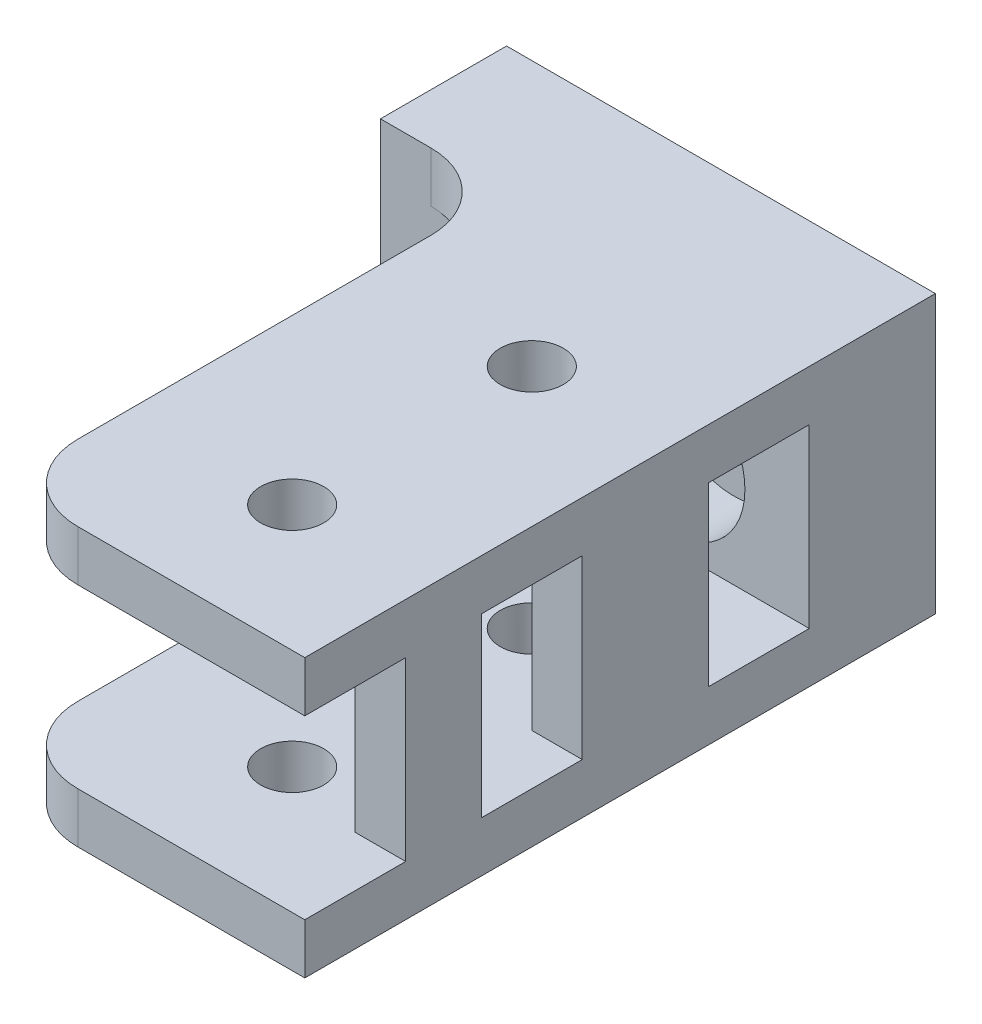
ISO-10303-21;
HEADER;
FILE_DESCRIPTION(('STEP AP214'),'2;1');
FILE_NAME('part.step','',(''),(''),'','','');
FILE_SCHEMA(('AUTOMOTIVE_DESIGN { 1 0 10303 214 1 1 1 1 }'));
ENDSEC;
DATA;
#1=APPLICATION_CONTEXT('core data for automotive mechanical design processes');
#2=APPLICATION_PROTOCOL_DEFINITION('international standard','automotive_design',2000,#1);
#3=PRODUCT_CONTEXT('',#1,'mechanical');
#4=PRODUCT('Part','Part','',(#3));
#5=PRODUCT_RELATED_PRODUCT_CATEGORY('part','',(#4));
#6=PRODUCT_DEFINITION_FORMATION('','',#4);
#7=PRODUCT_DEFINITION_CONTEXT('part definition',#1,'design');
#8=PRODUCT_DEFINITION('design','',#6,#7);
#9=PRODUCT_DEFINITION_SHAPE('','',#8);
#10=(LENGTH_UNIT() NAMED_UNIT(*) SI_UNIT(.MILLI.,.METRE.));
#11=(NAMED_UNIT(*) PLANE_ANGLE_UNIT() SI_UNIT($,.RADIAN.));
#12=(NAMED_UNIT(*) SI_UNIT($,.STERADIAN.) SOLID_ANGLE_UNIT());
#13=UNCERTAINTY_MEASURE_WITH_UNIT(LENGTH_MEASURE(1.E-05),#10,'distance_accuracy_value','');
#14=(GEOMETRIC_REPRESENTATION_CONTEXT(3) GLOBAL_UNCERTAINTY_ASSIGNED_CONTEXT((#13)) GLOBAL_UNIT_ASSIGNED_CONTEXT((#10,
#11,#12)) REPRESENTATION_CONTEXT('',''));
#15=CARTESIAN_POINT('',(0.,0.,0.));
#16=DIRECTION('',(0.,0.,1.));
#17=DIRECTION('',(1.,0.,0.));
#18=AXIS2_PLACEMENT_3D('',#15,#16,#17);
#19=CARTESIAN_POINT('',(11.5,-5.5,5.));
#20=DIRECTION('',(0.,0.,-1.));
#21=DIRECTION('',(-1.,0.,0.));
#22=AXIS2_PLACEMENT_3D('',#19,#20,#21);
#23=CYLINDRICAL_SURFACE('',#22,1.75);
#24=CARTESIAN_POINT('',(11.5,-5.5,0.));
#25=DIRECTION('',(0.,0.,1.));
#26=DIRECTION('',(1.,0.,0.));
#27=AXIS2_PLACEMENT_3D('',#24,#25,#26);
#28=CIRCLE('',#27,1.75);
#29=CARTESIAN_POINT('',(13.25,-5.5,0.));
#30=VERTEX_POINT('',#29);
#31=EDGE_CURVE('E380',#30,#30,#28,.T.);
#32=ORIENTED_EDGE('',*,*,#31,.F.);
#33=EDGE_LOOP('',(#32));
#34=FACE_BOUND('',#33,.T.);
#35=CARTESIAN_POINT('',(11.5,-5.5,2.5));
#36=DIRECTION('',(0.,0.,1.));
#37=DIRECTION('',(1.,0.,0.));
#38=AXIS2_PLACEMENT_3D('',#35,#36,#37);
#39=CIRCLE('',#38,1.75);
#40=CARTESIAN_POINT('',(13.25,-5.5,2.5));
#41=VERTEX_POINT('',#40);
#42=EDGE_CURVE('E232',#41,#41,#39,.T.);
#43=ORIENTED_EDGE('',*,*,#42,.T.);
#44=EDGE_LOOP('',(#43));
#45=FACE_BOUND('',#44,.T.);
#46=ADVANCED_FACE('F35',(#34,#45),#23,.F.);
#47=CARTESIAN_POINT('',(5.5,-5.5,5.));
#48=DIRECTION('',(0.,0.,-1.));
#49=DIRECTION('',(-1.,0.,0.));
#50=AXIS2_PLACEMENT_3D('',#47,#48,#49);
#51=CYLINDRICAL_SURFACE('',#50,1.75);
#52=CARTESIAN_POINT('',(5.5,-5.5,0.));
#53=DIRECTION('',(0.,0.,1.));
#54=DIRECTION('',(1.,0.,0.));
#55=AXIS2_PLACEMENT_3D('',#52,#53,#54);
#56=CIRCLE('',#55,1.75);
#57=CARTESIAN_POINT('',(7.25,-5.5,0.));
#58=VERTEX_POINT('',#57);
#59=EDGE_CURVE('E383',#58,#58,#56,.T.);
#60=ORIENTED_EDGE('',*,*,#59,.F.);
#61=EDGE_LOOP('',(#60));
#62=FACE_BOUND('',#61,.T.);
#63=CARTESIAN_POINT('',(5.5,-5.5,2.5));
#64=DIRECTION('',(0.,0.,1.));
#65=DIRECTION('',(1.,0.,0.));
#66=AXIS2_PLACEMENT_3D('',#63,#64,#65);
#67=CIRCLE('',#66,1.75);
#68=CARTESIAN_POINT('',(7.25,-5.5,2.5));
#69=VERTEX_POINT('',#68);
#70=EDGE_CURVE('E203',#69,#69,#67,.T.);
#71=ORIENTED_EDGE('',*,*,#70,.T.);
#72=EDGE_LOOP('',(#71));
#73=FACE_BOUND('',#72,.T.);
#74=ADVANCED_FACE('F469',(#62,#73),#51,.F.);
#75=CARTESIAN_POINT('',(15.,0.,25.));
#76=DIRECTION('',(-1.,0.,0.));
#77=DIRECTION('',(0.,-1.,0.));
#78=AXIS2_PLACEMENT_3D('',#75,#76,#77);
#79=PLANE('',#78);
#80=DIRECTION('',(0.,-1.,0.));
#81=VECTOR('',#80,1.);
#82=CARTESIAN_POINT('',(15.,-2.,21.));
#83=LINE('',#82,#81);
#84=CARTESIAN_POINT('',(15.,-2.,21.));
#85=VERTEX_POINT('',#84);
#86=CARTESIAN_POINT('',(15.,-9.,21.));
#87=VERTEX_POINT('',#86);
#88=EDGE_CURVE('E296',#85,#87,#83,.T.);
#89=ORIENTED_EDGE('',*,*,#88,.F.);
#90=DIRECTION('',(0.,0.,-1.));
#91=VECTOR('',#90,1.);
#92=CARTESIAN_POINT('',(15.,-2.,25.));
#93=LINE('',#92,#91);
#94=CARTESIAN_POINT('',(15.,-2.,18.));
#95=VERTEX_POINT('',#94);
#96=EDGE_CURVE('E379',#85,#95,#93,.T.);
#97=ORIENTED_EDGE('',*,*,#96,.T.);
#98=DIRECTION('',(0.,1.,0.));
#99=VECTOR('',#98,1.);
#100=CARTESIAN_POINT('',(15.,-2.,18.));
#101=LINE('',#100,#99);
#102=CARTESIAN_POINT('',(15.,-9.,18.));
#103=VERTEX_POINT('',#102);
#104=EDGE_CURVE('E295',#103,#95,#101,.T.);
#105=ORIENTED_EDGE('',*,*,#104,.F.);
#106=DIRECTION('',(0.,0.,-1.));
#107=VECTOR('',#106,1.);
#108=CARTESIAN_POINT('',(15.,-9.,25.));
#109=LINE('',#108,#107);
#110=EDGE_CURVE('E376',#87,#103,#109,.T.);
#111=ORIENTED_EDGE('',*,*,#110,.F.);
#112=EDGE_LOOP('',(#89,#97,#105,#111));
#113=FACE_BOUND('',#112,.T.);
#114=ADVANCED_FACE('F475',(#113),#79,.T.);
#115=CARTESIAN_POINT('',(0.,0.,25.));
#116=DIRECTION('',(0.,0.,1.));
#117=DIRECTION('',(1.,0.,0.));
#118=AXIS2_PLACEMENT_3D('',#115,#116,#117);
#119=PLANE('',#118);
#120=DIRECTION('',(-1.,0.,0.));
#121=VECTOR('',#120,1.);
#122=CARTESIAN_POINT('',(0.,0.,25.));
#123=LINE('',#122,#121);
#124=CARTESIAN_POINT('',(17.,0.,25.));
#125=VERTEX_POINT('',#124);
#126=CARTESIAN_POINT('',(8.,0.,25.));
#127=VERTEX_POINT('',#126);
#128=EDGE_CURVE('E361',#125,#127,#123,.T.);
#129=ORIENTED_EDGE('',*,*,#128,.T.);
#130=DIRECTION('',(0.,-1.,0.));
#131=VECTOR('',#130,1.);
#132=CARTESIAN_POINT('',(8.,-2.,25.));
#133=LINE('',#132,#131);
#134=CARTESIAN_POINT('',(8.,-2.,25.));
#135=VERTEX_POINT('',#134);
#136=EDGE_CURVE('E209',#127,#135,#133,.T.);
#137=ORIENTED_EDGE('',*,*,#136,.T.);
#138=DIRECTION('',(1.,0.,0.));
#139=VECTOR('',#138,1.);
#140=CARTESIAN_POINT('',(0.,-2.,25.));
#141=LINE('',#140,#139);
#142=CARTESIAN_POINT('',(17.,-2.,25.));
#143=VERTEX_POINT('',#142);
#144=EDGE_CURVE('E365',#135,#143,#141,.T.);
#145=ORIENTED_EDGE('',*,*,#144,.T.);
#146=DIRECTION('',(0.,1.,0.));
#147=VECTOR('',#146,1.);
#148=CARTESIAN_POINT('',(17.,0.,25.));
#149=LINE('',#148,#147);
#150=EDGE_CURVE('E362',#143,#125,#149,.T.);
#151=ORIENTED_EDGE('',*,*,#150,.T.);
#152=EDGE_LOOP('',(#129,#137,#145,#151));
#153=FACE_BOUND('',#152,.T.);
#154=ADVANCED_FACE('F448',(#153),#119,.T.);
#155=CARTESIAN_POINT('',(0.,0.,5.));
#156=DIRECTION('',(0.,0.,1.));
#157=DIRECTION('',(1.,0.,0.));
#158=AXIS2_PLACEMENT_3D('',#155,#156,#157);
#159=PLANE('',#158);
#160=CARTESIAN_POINT('',(11.5,-5.5,5.));
#161=DIRECTION('',(0.,0.,1.));
#162=DIRECTION('',(1.,0.,0.));
#163=AXIS2_PLACEMENT_3D('',#160,#161,#162);
#164=CIRCLE('',#163,2.95);
#165=CARTESIAN_POINT('',(14.45,-5.5,5.));
#166=VERTEX_POINT('',#165);
#167=EDGE_CURVE('E431',#166,#166,#164,.T.);
#168=ORIENTED_EDGE('',*,*,#167,.F.);
#169=EDGE_LOOP('',(#168));
#170=FACE_BOUND('',#169,.T.);
#171=CARTESIAN_POINT('',(5.5,-5.5,5.));
#172=DIRECTION('',(0.,0.,1.));
#173=DIRECTION('',(1.,0.,0.));
#174=AXIS2_PLACEMENT_3D('',#171,#172,#173);
#175=CIRCLE('',#174,2.95);
#176=CARTESIAN_POINT('',(8.45,-5.5,5.));
#177=VERTEX_POINT('',#176);
#178=EDGE_CURVE('E234',#177,#177,#175,.T.);
#179=ORIENTED_EDGE('',*,*,#178,.F.);
#180=EDGE_LOOP('',(#179));
#181=FACE_BOUND('',#180,.T.);
#182=DIRECTION('',(1.,0.,0.));
#183=VECTOR('',#182,1.);
#184=CARTESIAN_POINT('',(0.,-11.,5.));
#185=LINE('',#184,#183);
#186=CARTESIAN_POINT('',(0.,-11.,5.));
#187=VERTEX_POINT('',#186);
#188=CARTESIAN_POINT('',(2.,-11.,5.));
#189=VERTEX_POINT('',#188);
#190=EDGE_CURVE('E185',#187,#189,#185,.T.);
#191=ORIENTED_EDGE('',*,*,#190,.T.);
#192=DIRECTION('',(0.,-1.,0.));
#193=VECTOR('',#192,1.);
#194=CARTESIAN_POINT('',(2.,0.,5.));
#195=LINE('',#194,#193);
#196=CARTESIAN_POINT('',(2.,-9.,5.));
#197=VERTEX_POINT('',#196);
#198=EDGE_CURVE('E259',#189,#197,#195,.F.);
#199=ORIENTED_EDGE('',*,*,#198,.T.);
#200=DIRECTION('',(-1.,0.,0.));
#201=VECTOR('',#200,1.);
#202=CARTESIAN_POINT('',(0.,-9.,5.));
#203=LINE('',#202,#201);
#204=CARTESIAN_POINT('',(17.,-9.,5.));
#205=VERTEX_POINT('',#204);
#206=EDGE_CURVE('E50',#205,#197,#203,.T.);
#207=ORIENTED_EDGE('',*,*,#206,.F.);
#208=DIRECTION('',(0.,-1.,0.));
#209=VECTOR('',#208,1.);
#210=CARTESIAN_POINT('',(17.,0.,5.));
#211=LINE('',#210,#209);
#212=CARTESIAN_POINT('',(17.,-2.,5.));
#213=VERTEX_POINT('',#212);
#214=EDGE_CURVE('E355',#213,#205,#211,.T.);
#215=ORIENTED_EDGE('',*,*,#214,.F.);
#216=DIRECTION('',(1.,0.,0.));
#217=VECTOR('',#216,1.);
#218=CARTESIAN_POINT('',(0.,-2.,5.));
#219=LINE('',#218,#217);
#220=CARTESIAN_POINT('',(2.,-2.,5.));
#221=VERTEX_POINT('',#220);
#222=EDGE_CURVE('E58',#221,#213,#219,.T.);
#223=ORIENTED_EDGE('',*,*,#222,.F.);
#224=DIRECTION('',(0.,-1.,0.));
#225=VECTOR('',#224,1.);
#226=CARTESIAN_POINT('',(2.,0.,5.));
#227=LINE('',#226,#225);
#228=CARTESIAN_POINT('',(2.,0.,5.));
#229=VERTEX_POINT('',#228);
#230=EDGE_CURVE('E257',#221,#229,#227,.F.);
#231=ORIENTED_EDGE('',*,*,#230,.T.);
#232=DIRECTION('',(1.,0.,0.));
#233=VECTOR('',#232,1.);
#234=CARTESIAN_POINT('',(0.,0.,5.));
#235=LINE('',#234,#233);
#236=CARTESIAN_POINT('',(0.,0.,5.));
#237=VERTEX_POINT('',#236);
#238=EDGE_CURVE('E188',#237,#229,#235,.T.);
#239=ORIENTED_EDGE('',*,*,#238,.F.);
#240=DIRECTION('',(0.,-1.,0.));
#241=VECTOR('',#240,1.);
#242=CARTESIAN_POINT('',(0.,0.,5.));
#243=LINE('',#242,#241);
#244=EDGE_CURVE('E182',#237,#187,#243,.T.);
#245=ORIENTED_EDGE('',*,*,#244,.T.);
#246=EDGE_LOOP('',(#191,#199,#207,#215,#223,#231,#239,#245));
#247=FACE_BOUND('',#246,.T.);
#248=ADVANCED_FACE('F184',(#170,#181,#247),#159,.T.);
#249=CARTESIAN_POINT('',(0.,0.,0.));
#250=DIRECTION('',(0.,0.,1.));
#251=DIRECTION('',(1.,0.,0.));
#252=AXIS2_PLACEMENT_3D('',#249,#250,#251);
#253=PLANE('',#252);
#254=DIRECTION('',(0.,-1.,0.));
#255=VECTOR('',#254,1.);
#256=CARTESIAN_POINT('',(0.,0.,0.));
#257=LINE('',#256,#255);
#258=CARTESIAN_POINT('',(0.,0.,0.));
#259=VERTEX_POINT('',#258);
#260=CARTESIAN_POINT('',(0.,-11.,0.));
#261=VERTEX_POINT('',#260);
#262=EDGE_CURVE('E208',#259,#261,#257,.T.);
#263=ORIENTED_EDGE('',*,*,#262,.F.);
#264=DIRECTION('',(-1.,0.,0.));
#265=VECTOR('',#264,1.);
#266=CARTESIAN_POINT('',(0.,0.,0.));
#267=LINE('',#266,#265);
#268=CARTESIAN_POINT('',(17.,0.,0.));
#269=VERTEX_POINT('',#268);
#270=EDGE_CURVE('E193',#269,#259,#267,.T.);
#271=ORIENTED_EDGE('',*,*,#270,.F.);
#272=DIRECTION('',(0.,1.,0.));
#273=VECTOR('',#272,1.);
#274=CARTESIAN_POINT('',(17.,0.,0.));
#275=LINE('',#274,#273);
#276=CARTESIAN_POINT('',(17.,-11.,0.));
#277=VERTEX_POINT('',#276);
#278=EDGE_CURVE('E389',#277,#269,#275,.T.);
#279=ORIENTED_EDGE('',*,*,#278,.F.);
#280=DIRECTION('',(1.,0.,0.));
#281=VECTOR('',#280,1.);
#282=CARTESIAN_POINT('',(0.,-11.,0.));
#283=LINE('',#282,#281);
#284=EDGE_CURVE('E387',#261,#277,#283,.T.);
#285=ORIENTED_EDGE('',*,*,#284,.F.);
#286=EDGE_LOOP('',(#263,#271,#279,#285));
#287=FACE_BOUND('',#286,.T.);
#288=ORIENTED_EDGE('',*,*,#59,.T.);
#289=EDGE_LOOP('',(#288));
#290=FACE_BOUND('',#289,.T.);
#291=ORIENTED_EDGE('',*,*,#31,.T.);
#292=EDGE_LOOP('',(#291));
#293=FACE_BOUND('',#292,.T.);
#294=ADVANCED_FACE('F400',(#287,#290,#293),#253,.F.);
#295=CARTESIAN_POINT('',(0.,0.,5.));
#296=DIRECTION('',(1.,0.,0.));
#297=DIRECTION('',(0.,1.,0.));
#298=AXIS2_PLACEMENT_3D('',#295,#296,#297);
#299=PLANE('',#298);
#300=DIRECTION('',(0.,0.,-1.));
#301=VECTOR('',#300,1.);
#302=CARTESIAN_POINT('',(0.,-11.,5.));
#303=LINE('',#302,#301);
#304=EDGE_CURVE('E198',#187,#261,#303,.T.);
#305=ORIENTED_EDGE('',*,*,#304,.F.);
#306=ORIENTED_EDGE('',*,*,#244,.F.);
#307=DIRECTION('',(0.,0.,-1.));
#308=VECTOR('',#307,1.);
#309=CARTESIAN_POINT('',(0.,0.,5.));
#310=LINE('',#309,#308);
#311=EDGE_CURVE('E192',#237,#259,#310,.T.);
#312=ORIENTED_EDGE('',*,*,#311,.T.);
#313=ORIENTED_EDGE('',*,*,#262,.T.);
#314=EDGE_LOOP('',(#305,#306,#312,#313));
#315=FACE_BOUND('',#314,.T.);
#316=ADVANCED_FACE('F206',(#315),#299,.F.);
#317=CARTESIAN_POINT('',(0.,-11.,5.));
#318=DIRECTION('',(0.,1.,0.));
#319=DIRECTION('',(0.,0.,1.));
#320=AXIS2_PLACEMENT_3D('',#317,#318,#319);
#321=PLANE('',#320);
#322=CARTESIAN_POINT('',(11.5,-11.,10.5));
#323=DIRECTION('',(0.,-1.,0.));
#324=DIRECTION('',(0.,0.,-1.));
#325=AXIS2_PLACEMENT_3D('',#322,#323,#324);
#326=CIRCLE('',#325,1.25);
#327=CARTESIAN_POINT('',(11.5,-11.,9.25));
#328=VERTEX_POINT('',#327);
#329=EDGE_CURVE('E421',#328,#328,#326,.T.);
#330=ORIENTED_EDGE('',*,*,#329,.F.);
#331=EDGE_LOOP('',(#330));
#332=FACE_BOUND('',#331,.T.);
#333=CARTESIAN_POINT('',(11.5,-11.,20.));
#334=DIRECTION('',(0.,-1.,0.));
#335=DIRECTION('',(0.,0.,-1.));
#336=AXIS2_PLACEMENT_3D('',#333,#334,#335);
#337=CIRCLE('',#336,1.25);
#338=CARTESIAN_POINT('',(11.5,-11.,18.75));
#339=VERTEX_POINT('',#338);
#340=EDGE_CURVE('E224',#339,#339,#337,.T.);
#341=ORIENTED_EDGE('',*,*,#340,.F.);
#342=EDGE_LOOP('',(#341));
#343=FACE_BOUND('',#342,.T.);
#344=DIRECTION('',(1.,0.,0.));
#345=VECTOR('',#344,1.);
#346=CARTESIAN_POINT('',(0.,-11.,25.));
#347=LINE('',#346,#345);
#348=CARTESIAN_POINT('',(8.,-11.,25.));
#349=VERTEX_POINT('',#348);
#350=CARTESIAN_POINT('',(17.,-11.,25.));
#351=VERTEX_POINT('',#350);
#352=EDGE_CURVE('E370',#349,#351,#347,.T.);
#353=ORIENTED_EDGE('',*,*,#352,.F.);
#354=CARTESIAN_POINT('',(8.,-11.,22.));
#355=DIRECTION('',(0.,1.,0.));
#356=DIRECTION('',(0.,0.,1.));
#357=AXIS2_PLACEMENT_3D('',#354,#355,#356);
#358=CIRCLE('',#357,3.);
#359=CARTESIAN_POINT('',(5.,-11.,22.));
#360=VERTEX_POINT('',#359);
#361=EDGE_CURVE('E255',#349,#360,#358,.F.);
#362=ORIENTED_EDGE('',*,*,#361,.T.);
#363=DIRECTION('',(0.,0.,1.));
#364=VECTOR('',#363,1.);
#365=CARTESIAN_POINT('',(5.,-11.,5.));
#366=LINE('',#365,#364);
#367=CARTESIAN_POINT('',(5.,-11.,8.));
#368=VERTEX_POINT('',#367);
#369=EDGE_CURVE('E202',#368,#360,#366,.T.);
#370=ORIENTED_EDGE('',*,*,#369,.F.);
#371=CARTESIAN_POINT('',(2.,-11.,8.));
#372=DIRECTION('',(0.,1.,0.));
#373=DIRECTION('',(0.,0.,1.));
#374=AXIS2_PLACEMENT_3D('',#371,#372,#373);
#375=CIRCLE('',#374,3.);
#376=EDGE_CURVE('E201',#368,#189,#375,.T.);
#377=ORIENTED_EDGE('',*,*,#376,.T.);
#378=ORIENTED_EDGE('',*,*,#190,.F.);
#379=ORIENTED_EDGE('',*,*,#304,.T.);
#380=ORIENTED_EDGE('',*,*,#284,.T.);
#381=DIRECTION('',(0.,0.,-1.));
#382=VECTOR('',#381,1.);
#383=CARTESIAN_POINT('',(17.,-11.,5.));
#384=LINE('',#383,#382);
#385=EDGE_CURVE('E210',#351,#277,#384,.T.);
#386=ORIENTED_EDGE('',*,*,#385,.F.);
#387=EDGE_LOOP('',(#353,#362,#370,#377,#378,#379,#380,#386));
#388=FACE_BOUND('',#387,.T.);
#389=ADVANCED_FACE('F197',(#332,#343,#388),#321,.F.);
#390=CARTESIAN_POINT('',(17.,0.,5.));
#391=DIRECTION('',(-1.,0.,0.));
#392=DIRECTION('',(0.,0.,1.));
#393=AXIS2_PLACEMENT_3D('',#390,#391,#392);
#394=PLANE('',#393);
#395=DIRECTION('',(0.,0.,1.));
#396=VECTOR('',#395,1.);
#397=CARTESIAN_POINT('',(17.,-9.,5.));
#398=LINE('',#397,#396);
#399=CARTESIAN_POINT('',(17.,-9.,14.));
#400=VERTEX_POINT('',#399);
#401=CARTESIAN_POINT('',(17.,-9.,18.));
#402=VERTEX_POINT('',#401);
#403=EDGE_CURVE('E334',#400,#402,#398,.T.);
#404=ORIENTED_EDGE('',*,*,#403,.T.);
#405=DIRECTION('',(0.,1.,0.));
#406=VECTOR('',#405,1.);
#407=CARTESIAN_POINT('',(17.,0.,18.));
#408=LINE('',#407,#406);
#409=CARTESIAN_POINT('',(17.,-2.,18.));
#410=VERTEX_POINT('',#409);
#411=EDGE_CURVE('E325',#402,#410,#408,.T.);
#412=ORIENTED_EDGE('',*,*,#411,.T.);
#413=DIRECTION('',(0.,0.,-1.));
#414=VECTOR('',#413,1.);
#415=CARTESIAN_POINT('',(17.,-2.,5.));
#416=LINE('',#415,#414);
#417=CARTESIAN_POINT('',(17.,-2.,14.));
#418=VERTEX_POINT('',#417);
#419=EDGE_CURVE('E331',#410,#418,#416,.T.);
#420=ORIENTED_EDGE('',*,*,#419,.T.);
#421=DIRECTION('',(0.,-1.,0.));
#422=VECTOR('',#421,1.);
#423=CARTESIAN_POINT('',(17.,0.,14.));
#424=LINE('',#423,#422);
#425=EDGE_CURVE('E322',#418,#400,#424,.T.);
#426=ORIENTED_EDGE('',*,*,#425,.T.);
#427=EDGE_LOOP('',(#404,#412,#420,#426));
#428=FACE_BOUND('',#427,.T.);
#429=DIRECTION('',(0.,0.,-1.));
#430=VECTOR('',#429,1.);
#431=CARTESIAN_POINT('',(17.,-2.,5.));
#432=LINE('',#431,#430);
#433=CARTESIAN_POINT('',(17.,-2.,9.));
#434=VERTEX_POINT('',#433);
#435=EDGE_CURVE('E352',#434,#213,#432,.T.);
#436=ORIENTED_EDGE('',*,*,#435,.T.);
#437=ORIENTED_EDGE('',*,*,#214,.T.);
#438=DIRECTION('',(0.,0.,1.));
#439=VECTOR('',#438,1.);
#440=CARTESIAN_POINT('',(17.,-9.,5.));
#441=LINE('',#440,#439);
#442=CARTESIAN_POINT('',(17.,-9.,9.));
#443=VERTEX_POINT('',#442);
#444=EDGE_CURVE('E344',#205,#443,#441,.T.);
#445=ORIENTED_EDGE('',*,*,#444,.T.);
#446=DIRECTION('',(0.,1.,0.));
#447=VECTOR('',#446,1.);
#448=CARTESIAN_POINT('',(17.,0.,9.));
#449=LINE('',#448,#447);
#450=EDGE_CURVE('E349',#443,#434,#449,.T.);
#451=ORIENTED_EDGE('',*,*,#450,.T.);
#452=EDGE_LOOP('',(#436,#437,#445,#451));
#453=FACE_BOUND('',#452,.T.);
#454=ORIENTED_EDGE('',*,*,#150,.F.);
#455=DIRECTION('',(0.,0.,-1.));
#456=VECTOR('',#455,1.);
#457=CARTESIAN_POINT('',(17.,-2.,5.));
#458=LINE('',#457,#456);
#459=CARTESIAN_POINT('',(17.,-2.,21.));
#460=VERTEX_POINT('',#459);
#461=EDGE_CURVE('E319',#143,#460,#458,.T.);
#462=ORIENTED_EDGE('',*,*,#461,.T.);
#463=DIRECTION('',(0.,-1.,0.));
#464=VECTOR('',#463,1.);
#465=CARTESIAN_POINT('',(17.,0.,21.));
#466=LINE('',#465,#464);
#467=CARTESIAN_POINT('',(17.,-9.,21.));
#468=VERTEX_POINT('',#467);
#469=EDGE_CURVE('E328',#460,#468,#466,.T.);
#470=ORIENTED_EDGE('',*,*,#469,.T.);
#471=DIRECTION('',(0.,0.,1.));
#472=VECTOR('',#471,1.);
#473=CARTESIAN_POINT('',(17.,-9.,5.));
#474=LINE('',#473,#472);
#475=CARTESIAN_POINT('',(17.,-9.,25.));
#476=VERTEX_POINT('',#475);
#477=EDGE_CURVE('E303',#468,#476,#474,.T.);
#478=ORIENTED_EDGE('',*,*,#477,.T.);
#479=EDGE_CURVE('E358',#351,#476,#149,.T.);
#480=ORIENTED_EDGE('',*,*,#479,.F.);
#481=ORIENTED_EDGE('',*,*,#385,.T.);
#482=ORIENTED_EDGE('',*,*,#278,.T.);
#483=DIRECTION('',(0.,0.,-1.));
#484=VECTOR('',#483,1.);
#485=CARTESIAN_POINT('',(17.,0.,5.));
#486=LINE('',#485,#484);
#487=EDGE_CURVE('E216',#125,#269,#486,.T.);
#488=ORIENTED_EDGE('',*,*,#487,.F.);
#489=EDGE_LOOP('',(#454,#462,#470,#478,#480,#481,#482,#488));
#490=FACE_BOUND('',#489,.T.);
#491=ADVANCED_FACE('F404',(#428,#453,#490),#394,.F.);
#492=CARTESIAN_POINT('',(0.,0.,5.));
#493=DIRECTION('',(0.,-1.,0.));
#494=DIRECTION('',(0.,0.,-1.));
#495=AXIS2_PLACEMENT_3D('',#492,#493,#494);
#496=PLANE('',#495);
#497=CARTESIAN_POINT('',(11.5,0.,10.5));
#498=DIRECTION('',(0.,-1.,0.));
#499=DIRECTION('',(0.,0.,-1.));
#500=AXIS2_PLACEMENT_3D('',#497,#498,#499);
#501=CIRCLE('',#500,1.25);
#502=CARTESIAN_POINT('',(11.5,0.,9.25));
#503=VERTEX_POINT('',#502);
#504=EDGE_CURVE('E285',#503,#503,#501,.T.);
#505=ORIENTED_EDGE('',*,*,#504,.T.);
#506=EDGE_LOOP('',(#505));
#507=FACE_BOUND('',#506,.T.);
#508=CARTESIAN_POINT('',(11.5,0.,20.));
#509=DIRECTION('',(0.,-1.,0.));
#510=DIRECTION('',(0.,0.,-1.));
#511=AXIS2_PLACEMENT_3D('',#508,#509,#510);
#512=CIRCLE('',#511,1.25);
#513=CARTESIAN_POINT('',(11.5,0.,18.75));
#514=VERTEX_POINT('',#513);
#515=EDGE_CURVE('E292',#514,#514,#512,.T.);
#516=ORIENTED_EDGE('',*,*,#515,.T.);
#517=EDGE_LOOP('',(#516));
#518=FACE_BOUND('',#517,.T.);
#519=DIRECTION('',(0.,0.,1.));
#520=VECTOR('',#519,1.);
#521=CARTESIAN_POINT('',(5.,0.,5.));
#522=LINE('',#521,#520);
#523=CARTESIAN_POINT('',(5.,0.,8.));
#524=VERTEX_POINT('',#523);
#525=CARTESIAN_POINT('',(5.,0.,22.));
#526=VERTEX_POINT('',#525);
#527=EDGE_CURVE('E278',#524,#526,#522,.T.);
#528=ORIENTED_EDGE('',*,*,#527,.T.);
#529=CARTESIAN_POINT('',(8.,0.,22.));
#530=DIRECTION('',(0.,-1.,0.));
#531=DIRECTION('',(0.,0.,-1.));
#532=AXIS2_PLACEMENT_3D('',#529,#530,#531);
#533=CIRCLE('',#532,3.);
#534=EDGE_CURVE('E243',#526,#127,#533,.F.);
#535=ORIENTED_EDGE('',*,*,#534,.T.);
#536=ORIENTED_EDGE('',*,*,#128,.F.);
#537=ORIENTED_EDGE('',*,*,#487,.T.);
#538=ORIENTED_EDGE('',*,*,#270,.T.);
#539=ORIENTED_EDGE('',*,*,#311,.F.);
#540=ORIENTED_EDGE('',*,*,#238,.T.);
#541=CARTESIAN_POINT('',(2.,0.,8.));
#542=DIRECTION('',(0.,-1.,0.));
#543=DIRECTION('',(0.,0.,-1.));
#544=AXIS2_PLACEMENT_3D('',#541,#542,#543);
#545=CIRCLE('',#544,3.);
#546=EDGE_CURVE('E11',#229,#524,#545,.T.);
#547=ORIENTED_EDGE('',*,*,#546,.T.);
#548=EDGE_LOOP('',(#528,#535,#536,#537,#538,#539,#540,#547));
#549=FACE_BOUND('',#548,.T.);
#550=ADVANCED_FACE('F275',(#507,#518,#549),#496,.F.);
#551=CARTESIAN_POINT('',(0.,-2.,25.));
#552=DIRECTION('',(0.,1.,0.));
#553=DIRECTION('',(-1.,0.,0.));
#554=AXIS2_PLACEMENT_3D('',#551,#552,#553);
#555=PLANE('',#554);
#556=CARTESIAN_POINT('',(11.5,-2.,10.5));
#557=DIRECTION('',(0.,1.,0.));
#558=DIRECTION('',(-1.,0.,0.));
#559=AXIS2_PLACEMENT_3D('',#556,#557,#558);
#560=CIRCLE('',#559,1.25);
#561=CARTESIAN_POINT('',(10.25,-2.,10.5));
#562=VERTEX_POINT('',#561);
#563=EDGE_CURVE('E228',#562,#562,#560,.T.);
#564=ORIENTED_EDGE('',*,*,#563,.T.);
#565=EDGE_LOOP('',(#564));
#566=FACE_BOUND('',#565,.T.);
#567=CARTESIAN_POINT('',(11.5,-2.,20.));
#568=DIRECTION('',(0.,1.,0.));
#569=DIRECTION('',(-1.,0.,0.));
#570=AXIS2_PLACEMENT_3D('',#567,#568,#569);
#571=CIRCLE('',#570,1.25);
#572=CARTESIAN_POINT('',(10.25,-2.,20.));
#573=VERTEX_POINT('',#572);
#574=EDGE_CURVE('E223',#573,#573,#571,.T.);
#575=ORIENTED_EDGE('',*,*,#574,.T.);
#576=EDGE_LOOP('',(#575));
#577=FACE_BOUND('',#576,.T.);
#578=ORIENTED_EDGE('',*,*,#144,.F.);
#579=CARTESIAN_POINT('',(8.,-2.,22.));
#580=DIRECTION('',(0.,1.,0.));
#581=DIRECTION('',(-1.,0.,0.));
#582=AXIS2_PLACEMENT_3D('',#579,#580,#581);
#583=CIRCLE('',#582,3.);
#584=CARTESIAN_POINT('',(5.,-2.,22.));
#585=VERTEX_POINT('',#584);
#586=EDGE_CURVE('E213',#135,#585,#583,.F.);
#587=ORIENTED_EDGE('',*,*,#586,.T.);
#588=DIRECTION('',(0.,0.,-1.));
#589=VECTOR('',#588,1.);
#590=CARTESIAN_POINT('',(5.,-2.,25.));
#591=LINE('',#590,#589);
#592=CARTESIAN_POINT('',(5.,-2.,8.));
#593=VERTEX_POINT('',#592);
#594=EDGE_CURVE('E269',#585,#593,#591,.T.);
#595=ORIENTED_EDGE('',*,*,#594,.T.);
#596=CARTESIAN_POINT('',(2.,-2.,8.));
#597=DIRECTION('',(0.,1.,0.));
#598=DIRECTION('',(-1.,0.,0.));
#599=AXIS2_PLACEMENT_3D('',#596,#597,#598);
#600=CIRCLE('',#599,3.);
#601=EDGE_CURVE('E43',#593,#221,#600,.T.);
#602=ORIENTED_EDGE('',*,*,#601,.T.);
#603=ORIENTED_EDGE('',*,*,#222,.T.);
#604=ORIENTED_EDGE('',*,*,#435,.F.);
#605=DIRECTION('',(-1.,0.,0.));
#606=VECTOR('',#605,1.);
#607=CARTESIAN_POINT('',(35.,-1.99999999999999,9.));
#608=LINE('',#607,#606);
#609=CARTESIAN_POINT('',(15.,-2.,9.));
#610=VERTEX_POINT('',#609);
#611=EDGE_CURVE('E341',#434,#610,#608,.T.);
#612=ORIENTED_EDGE('',*,*,#611,.T.);
#613=CARTESIAN_POINT('',(15.,-2.,14.));
#614=VERTEX_POINT('',#613);
#615=EDGE_CURVE('E377',#614,#610,#93,.T.);
#616=ORIENTED_EDGE('',*,*,#615,.F.);
#617=DIRECTION('',(-1.,0.,0.));
#618=VECTOR('',#617,1.);
#619=CARTESIAN_POINT('',(35.,-1.99999999999999,14.));
#620=LINE('',#619,#618);
#621=EDGE_CURVE('E314',#418,#614,#620,.T.);
#622=ORIENTED_EDGE('',*,*,#621,.F.);
#623=ORIENTED_EDGE('',*,*,#419,.F.);
#624=DIRECTION('',(-1.,0.,0.));
#625=VECTOR('',#624,1.);
#626=CARTESIAN_POINT('',(35.,-1.99999999999999,18.));
#627=LINE('',#626,#625);
#628=EDGE_CURVE('E309',#410,#95,#627,.T.);
#629=ORIENTED_EDGE('',*,*,#628,.T.);
#630=ORIENTED_EDGE('',*,*,#96,.F.);
#631=DIRECTION('',(-1.,0.,0.));
#632=VECTOR('',#631,1.);
#633=CARTESIAN_POINT('',(35.,-1.99999999999999,21.));
#634=LINE('',#633,#632);
#635=EDGE_CURVE('E301',#460,#85,#634,.T.);
#636=ORIENTED_EDGE('',*,*,#635,.F.);
#637=ORIENTED_EDGE('',*,*,#461,.F.);
#638=EDGE_LOOP('',(#578,#587,#595,#602,#603,#604,#612,#616,#622,#623,#629,#630,#636,#637));
#639=FACE_BOUND('',#638,.T.);
#640=ADVANCED_FACE('F267',(#566,#577,#639),#555,.F.);
#641=DIRECTION('',(0.,-1.,0.));
#642=VECTOR('',#641,1.);
#643=CARTESIAN_POINT('',(15.,-2.,14.));
#644=LINE('',#643,#642);
#645=CARTESIAN_POINT('',(15.,-9.,14.));
#646=VERTEX_POINT('',#645);
#647=EDGE_CURVE('E307',#614,#646,#644,.T.);
#648=ORIENTED_EDGE('',*,*,#647,.F.);
#649=ORIENTED_EDGE('',*,*,#615,.T.);
#650=DIRECTION('',(0.,1.,0.));
#651=VECTOR('',#650,1.);
#652=CARTESIAN_POINT('',(15.,-2.,9.));
#653=LINE('',#652,#651);
#654=CARTESIAN_POINT('',(15.,-9.,9.));
#655=VERTEX_POINT('',#654);
#656=EDGE_CURVE('E337',#655,#610,#653,.T.);
#657=ORIENTED_EDGE('',*,*,#656,.F.);
#658=EDGE_CURVE('E372',#646,#655,#109,.T.);
#659=ORIENTED_EDGE('',*,*,#658,.F.);
#660=EDGE_LOOP('',(#648,#649,#657,#659));
#661=FACE_BOUND('',#660,.T.);
#662=ADVANCED_FACE('F517',(#661),#79,.T.);
#663=CARTESIAN_POINT('',(0.,-9.,25.));
#664=DIRECTION('',(0.,-1.,0.));
#665=DIRECTION('',(1.,0.,0.));
#666=AXIS2_PLACEMENT_3D('',#663,#664,#665);
#667=PLANE('',#666);
#668=CARTESIAN_POINT('',(11.5,-9.,10.5));
#669=DIRECTION('',(0.,-1.,0.));
#670=DIRECTION('',(1.,0.,0.));
#671=AXIS2_PLACEMENT_3D('',#668,#669,#670);
#672=CIRCLE('',#671,1.25);
#673=CARTESIAN_POINT('',(12.75,-9.,10.5));
#674=VERTEX_POINT('',#673);
#675=EDGE_CURVE('E225',#674,#674,#672,.T.);
#676=ORIENTED_EDGE('',*,*,#675,.T.);
#677=EDGE_LOOP('',(#676));
#678=FACE_BOUND('',#677,.T.);
#679=CARTESIAN_POINT('',(11.5,-9.,20.));
#680=DIRECTION('',(0.,-1.,0.));
#681=DIRECTION('',(1.,0.,0.));
#682=AXIS2_PLACEMENT_3D('',#679,#680,#681);
#683=CIRCLE('',#682,1.25);
#684=CARTESIAN_POINT('',(12.75,-9.,20.));
#685=VERTEX_POINT('',#684);
#686=EDGE_CURVE('E220',#685,#685,#683,.T.);
#687=ORIENTED_EDGE('',*,*,#686,.T.);
#688=EDGE_LOOP('',(#687));
#689=FACE_BOUND('',#688,.T.);
#690=DIRECTION('',(0.,0.,1.));
#691=VECTOR('',#690,1.);
#692=CARTESIAN_POINT('',(5.,-9.,25.));
#693=LINE('',#692,#691);
#694=CARTESIAN_POINT('',(5.,-9.,8.));
#695=VERTEX_POINT('',#694);
#696=CARTESIAN_POINT('',(5.,-9.,22.));
#697=VERTEX_POINT('',#696);
#698=EDGE_CURVE('E417',#695,#697,#693,.T.);
#699=ORIENTED_EDGE('',*,*,#698,.T.);
#700=CARTESIAN_POINT('',(8.,-9.,22.));
#701=DIRECTION('',(0.,-1.,0.));
#702=DIRECTION('',(1.,0.,0.));
#703=AXIS2_PLACEMENT_3D('',#700,#701,#702);
#704=CIRCLE('',#703,3.);
#705=CARTESIAN_POINT('',(8.,-9.,25.));
#706=VERTEX_POINT('',#705);
#707=EDGE_CURVE('E251',#697,#706,#704,.F.);
#708=ORIENTED_EDGE('',*,*,#707,.T.);
#709=DIRECTION('',(-1.,0.,0.));
#710=VECTOR('',#709,1.);
#711=CARTESIAN_POINT('',(0.,-9.,25.));
#712=LINE('',#711,#710);
#713=EDGE_CURVE('E367',#476,#706,#712,.T.);
#714=ORIENTED_EDGE('',*,*,#713,.F.);
#715=ORIENTED_EDGE('',*,*,#477,.F.);
#716=DIRECTION('',(-1.,0.,0.));
#717=VECTOR('',#716,1.);
#718=CARTESIAN_POINT('',(35.,-8.99999999999999,21.));
#719=LINE('',#718,#717);
#720=EDGE_CURVE('E299',#468,#87,#719,.T.);
#721=ORIENTED_EDGE('',*,*,#720,.T.);
#722=ORIENTED_EDGE('',*,*,#110,.T.);
#723=DIRECTION('',(-1.,0.,0.));
#724=VECTOR('',#723,1.);
#725=CARTESIAN_POINT('',(35.,-8.99999999999999,18.));
#726=LINE('',#725,#724);
#727=EDGE_CURVE('E300',#402,#103,#726,.T.);
#728=ORIENTED_EDGE('',*,*,#727,.F.);
#729=ORIENTED_EDGE('',*,*,#403,.F.);
#730=DIRECTION('',(-1.,0.,0.));
#731=VECTOR('',#730,1.);
#732=CARTESIAN_POINT('',(35.,-8.99999999999999,14.));
#733=LINE('',#732,#731);
#734=EDGE_CURVE('E311',#400,#646,#733,.T.);
#735=ORIENTED_EDGE('',*,*,#734,.T.);
#736=ORIENTED_EDGE('',*,*,#658,.T.);
#737=DIRECTION('',(-1.,0.,0.));
#738=VECTOR('',#737,1.);
#739=CARTESIAN_POINT('',(35.,-8.99999999999999,9.));
#740=LINE('',#739,#738);
#741=EDGE_CURVE('E340',#443,#655,#740,.T.);
#742=ORIENTED_EDGE('',*,*,#741,.F.);
#743=ORIENTED_EDGE('',*,*,#444,.F.);
#744=ORIENTED_EDGE('',*,*,#206,.T.);
#745=CARTESIAN_POINT('',(2.,-9.,8.));
#746=DIRECTION('',(0.,-1.,0.));
#747=DIRECTION('',(1.,0.,0.));
#748=AXIS2_PLACEMENT_3D('',#745,#746,#747);
#749=CIRCLE('',#748,3.);
#750=EDGE_CURVE('E262',#197,#695,#749,.T.);
#751=ORIENTED_EDGE('',*,*,#750,.T.);
#752=EDGE_LOOP('',(#699,#708,#714,#715,#721,#722,#728,#729,#735,#736,#742,#743,#744,#751));
#753=FACE_BOUND('',#752,.T.);
#754=ADVANCED_FACE('F419',(#678,#689,#753),#667,.F.);
#755=ORIENTED_EDGE('',*,*,#713,.T.);
#756=DIRECTION('',(0.,1.,0.));
#757=VECTOR('',#756,1.);
#758=CARTESIAN_POINT('',(8.,-11.,25.));
#759=LINE('',#758,#757);
#760=EDGE_CURVE('E253',#706,#349,#759,.F.);
#761=ORIENTED_EDGE('',*,*,#760,.T.);
#762=ORIENTED_EDGE('',*,*,#352,.T.);
#763=ORIENTED_EDGE('',*,*,#479,.T.);
#764=EDGE_LOOP('',(#755,#761,#762,#763));
#765=FACE_BOUND('',#764,.T.);
#766=ADVANCED_FACE('F406',(#765),#119,.T.);
#767=CARTESIAN_POINT('',(35.,-1.99999999999999,9.));
#768=DIRECTION('',(0.,0.,1.));
#769=DIRECTION('',(1.,0.,0.));
#770=AXIS2_PLACEMENT_3D('',#767,#768,#769);
#771=PLANE('',#770);
#772=ORIENTED_EDGE('',*,*,#741,.T.);
#773=ORIENTED_EDGE('',*,*,#656,.T.);
#774=ORIENTED_EDGE('',*,*,#611,.F.);
#775=ORIENTED_EDGE('',*,*,#450,.F.);
#776=EDGE_LOOP('',(#772,#773,#774,#775));
#777=FACE_BOUND('',#776,.T.);
#778=ADVANCED_FACE('F512',(#777),#771,.F.);
#779=CARTESIAN_POINT('',(35.,-1.99999999999999,21.));
#780=DIRECTION('',(0.,0.,-1.));
#781=DIRECTION('',(-1.,0.,0.));
#782=AXIS2_PLACEMENT_3D('',#779,#780,#781);
#783=PLANE('',#782);
#784=ORIENTED_EDGE('',*,*,#635,.T.);
#785=ORIENTED_EDGE('',*,*,#88,.T.);
#786=ORIENTED_EDGE('',*,*,#720,.F.);
#787=ORIENTED_EDGE('',*,*,#469,.F.);
#788=EDGE_LOOP('',(#784,#785,#786,#787));
#789=FACE_BOUND('',#788,.T.);
#790=ADVANCED_FACE('F563',(#789),#783,.F.);
#791=CARTESIAN_POINT('',(35.,-1.99999999999999,18.));
#792=DIRECTION('',(0.,0.,1.));
#793=DIRECTION('',(1.,0.,0.));
#794=AXIS2_PLACEMENT_3D('',#791,#792,#793);
#795=PLANE('',#794);
#796=ORIENTED_EDGE('',*,*,#727,.T.);
#797=ORIENTED_EDGE('',*,*,#104,.T.);
#798=ORIENTED_EDGE('',*,*,#628,.F.);
#799=ORIENTED_EDGE('',*,*,#411,.F.);
#800=EDGE_LOOP('',(#796,#797,#798,#799));
#801=FACE_BOUND('',#800,.T.);
#802=ADVANCED_FACE('F525',(#801),#795,.F.);
#803=CARTESIAN_POINT('',(35.,-1.99999999999999,14.));
#804=DIRECTION('',(0.,0.,-1.));
#805=DIRECTION('',(-1.,0.,0.));
#806=AXIS2_PLACEMENT_3D('',#803,#804,#805);
#807=PLANE('',#806);
#808=ORIENTED_EDGE('',*,*,#621,.T.);
#809=ORIENTED_EDGE('',*,*,#647,.T.);
#810=ORIENTED_EDGE('',*,*,#734,.F.);
#811=ORIENTED_EDGE('',*,*,#425,.F.);
#812=EDGE_LOOP('',(#808,#809,#810,#811));
#813=FACE_BOUND('',#812,.T.);
#814=ADVANCED_FACE('F522',(#813),#807,.F.);
#815=CARTESIAN_POINT('',(11.5,9.,20.));
#816=DIRECTION('',(0.,-1.,0.));
#817=DIRECTION('',(0.,0.,-1.));
#818=AXIS2_PLACEMENT_3D('',#815,#816,#817);
#819=CYLINDRICAL_SURFACE('',#818,1.25);
#820=ORIENTED_EDGE('',*,*,#340,.T.);
#821=EDGE_LOOP('',(#820));
#822=FACE_BOUND('',#821,.T.);
#823=ORIENTED_EDGE('',*,*,#686,.F.);
#824=EDGE_LOOP('',(#823));
#825=FACE_BOUND('',#824,.T.);
#826=ADVANCED_FACE('F554',(#822,#825),#819,.F.);
#827=ORIENTED_EDGE('',*,*,#574,.F.);
#828=EDGE_LOOP('',(#827));
#829=FACE_BOUND('',#828,.T.);
#830=ORIENTED_EDGE('',*,*,#515,.F.);
#831=EDGE_LOOP('',(#830));
#832=FACE_BOUND('',#831,.T.);
#833=ADVANCED_FACE('F550',(#829,#832),#819,.F.);
#834=CARTESIAN_POINT('',(5.,9.,5.));
#835=DIRECTION('',(1.,0.,0.));
#836=DIRECTION('',(0.,0.,-1.));
#837=AXIS2_PLACEMENT_3D('',#834,#835,#836);
#838=PLANE('',#837);
#839=ORIENTED_EDGE('',*,*,#369,.T.);
#840=DIRECTION('',(0.,1.,0.));
#841=VECTOR('',#840,1.);
#842=CARTESIAN_POINT('',(5.,-9.,22.));
#843=LINE('',#842,#841);
#844=EDGE_CURVE('E248',#360,#697,#843,.T.);
#845=ORIENTED_EDGE('',*,*,#844,.T.);
#846=ORIENTED_EDGE('',*,*,#698,.F.);
#847=DIRECTION('',(0.,-1.,0.));
#848=VECTOR('',#847,1.);
#849=CARTESIAN_POINT('',(5.,9.,8.));
#850=LINE('',#849,#848);
#851=EDGE_CURVE('E245',#695,#368,#850,.T.);
#852=ORIENTED_EDGE('',*,*,#851,.T.);
#853=EDGE_LOOP('',(#839,#845,#846,#852));
#854=FACE_BOUND('',#853,.T.);
#855=ADVANCED_FACE('F416',(#854),#838,.F.);
#856=CARTESIAN_POINT('',(11.5,9.,10.5));
#857=DIRECTION('',(0.,-1.,0.));
#858=DIRECTION('',(0.,0.,-1.));
#859=AXIS2_PLACEMENT_3D('',#856,#857,#858);
#860=CYLINDRICAL_SURFACE('',#859,1.25);
#861=ORIENTED_EDGE('',*,*,#329,.T.);
#862=EDGE_LOOP('',(#861));
#863=FACE_BOUND('',#862,.T.);
#864=ORIENTED_EDGE('',*,*,#675,.F.);
#865=EDGE_LOOP('',(#864));
#866=FACE_BOUND('',#865,.T.);
#867=ADVANCED_FACE('F466',(#863,#866),#860,.F.);
#868=ORIENTED_EDGE('',*,*,#594,.F.);
#869=DIRECTION('',(0.,-1.,0.));
#870=VECTOR('',#869,1.);
#871=CARTESIAN_POINT('',(5.,0.,22.));
#872=LINE('',#871,#870);
#873=EDGE_CURVE('E241',#585,#526,#872,.F.);
#874=ORIENTED_EDGE('',*,*,#873,.T.);
#875=ORIENTED_EDGE('',*,*,#527,.F.);
#876=DIRECTION('',(0.,-1.,0.));
#877=VECTOR('',#876,1.);
#878=CARTESIAN_POINT('',(5.,9.,8.));
#879=LINE('',#878,#877);
#880=EDGE_CURVE('E238',#524,#593,#879,.T.);
#881=ORIENTED_EDGE('',*,*,#880,.T.);
#882=EDGE_LOOP('',(#868,#874,#875,#881));
#883=FACE_BOUND('',#882,.T.);
#884=ADVANCED_FACE('F463',(#883),#838,.F.);
#885=ORIENTED_EDGE('',*,*,#563,.F.);
#886=EDGE_LOOP('',(#885));
#887=FACE_BOUND('',#886,.T.);
#888=ORIENTED_EDGE('',*,*,#504,.F.);
#889=EDGE_LOOP('',(#888));
#890=FACE_BOUND('',#889,.T.);
#891=ADVANCED_FACE('F454',(#887,#890),#860,.F.);
#892=CARTESIAN_POINT('',(5.5,-5.5,2.5));
#893=DIRECTION('',(0.,0.,1.));
#894=DIRECTION('',(1.,0.,0.));
#895=AXIS2_PLACEMENT_3D('',#892,#893,#894);
#896=CYLINDRICAL_SURFACE('',#895,2.95);
#897=CARTESIAN_POINT('',(5.5,-5.5,2.5));
#898=DIRECTION('',(0.,0.,1.));
#899=DIRECTION('',(1.,0.,0.));
#900=AXIS2_PLACEMENT_3D('',#897,#898,#899);
#901=CIRCLE('',#900,2.95);
#902=CARTESIAN_POINT('',(8.45,-5.5,2.5));
#903=VERTEX_POINT('',#902);
#904=EDGE_CURVE('E231',#903,#903,#901,.T.);
#905=ORIENTED_EDGE('',*,*,#904,.F.);
#906=EDGE_LOOP('',(#905));
#907=FACE_BOUND('',#906,.T.);
#908=ORIENTED_EDGE('',*,*,#178,.T.);
#909=EDGE_LOOP('',(#908));
#910=FACE_BOUND('',#909,.T.);
#911=ADVANCED_FACE('F452',(#907,#910),#896,.F.);
#912=CARTESIAN_POINT('',(5.5,-5.5,2.5));
#913=DIRECTION('',(0.,0.,1.));
#914=DIRECTION('',(1.,0.,0.));
#915=AXIS2_PLACEMENT_3D('',#912,#913,#914);
#916=PLANE('',#915);
#917=ORIENTED_EDGE('',*,*,#70,.F.);
#918=EDGE_LOOP('',(#917));
#919=FACE_BOUND('',#918,.T.);
#920=ORIENTED_EDGE('',*,*,#904,.T.);
#921=EDGE_LOOP('',(#920));
#922=FACE_BOUND('',#921,.T.);
#923=ADVANCED_FACE('F442',(#919,#922),#916,.T.);
#924=CARTESIAN_POINT('',(11.5,-5.5,2.5));
#925=DIRECTION('',(0.,0.,1.));
#926=DIRECTION('',(1.,0.,0.));
#927=AXIS2_PLACEMENT_3D('',#924,#925,#926);
#928=CYLINDRICAL_SURFACE('',#927,2.95);
#929=CARTESIAN_POINT('',(11.5,-5.5,2.5));
#930=DIRECTION('',(0.,0.,1.));
#931=DIRECTION('',(1.,0.,0.));
#932=AXIS2_PLACEMENT_3D('',#929,#930,#931);
#933=CIRCLE('',#932,2.95);
#934=CARTESIAN_POINT('',(14.45,-5.5,2.5));
#935=VERTEX_POINT('',#934);
#936=EDGE_CURVE('E235',#935,#935,#933,.T.);
#937=ORIENTED_EDGE('',*,*,#936,.F.);
#938=EDGE_LOOP('',(#937));
#939=FACE_BOUND('',#938,.T.);
#940=ORIENTED_EDGE('',*,*,#167,.T.);
#941=EDGE_LOOP('',(#940));
#942=FACE_BOUND('',#941,.T.);
#943=ADVANCED_FACE('F439',(#939,#942),#928,.F.);
#944=CARTESIAN_POINT('',(11.5,-5.5,2.5));
#945=DIRECTION('',(0.,0.,1.));
#946=DIRECTION('',(1.,0.,0.));
#947=AXIS2_PLACEMENT_3D('',#944,#945,#946);
#948=PLANE('',#947);
#949=ORIENTED_EDGE('',*,*,#42,.F.);
#950=EDGE_LOOP('',(#949));
#951=FACE_BOUND('',#950,.T.);
#952=ORIENTED_EDGE('',*,*,#936,.T.);
#953=EDGE_LOOP('',(#952));
#954=FACE_BOUND('',#953,.T.);
#955=ADVANCED_FACE('F437',(#951,#954),#948,.T.);
#956=CARTESIAN_POINT('',(8.,0.,22.));
#957=DIRECTION('',(0.,1.,0.));
#958=DIRECTION('',(0.,0.,1.));
#959=AXIS2_PLACEMENT_3D('',#956,#957,#958);
#960=CYLINDRICAL_SURFACE('',#959,3.);
#961=ORIENTED_EDGE('',*,*,#534,.F.);
#962=ORIENTED_EDGE('',*,*,#873,.F.);
#963=ORIENTED_EDGE('',*,*,#586,.F.);
#964=ORIENTED_EDGE('',*,*,#136,.F.);
#965=EDGE_LOOP('',(#961,#962,#963,#964));
#966=FACE_BOUND('',#965,.T.);
#967=ADVANCED_FACE('F496',(#966),#960,.T.);
#968=CARTESIAN_POINT('',(8.,9.,22.));
#969=DIRECTION('',(0.,-1.,0.));
#970=DIRECTION('',(0.,0.,-1.));
#971=AXIS2_PLACEMENT_3D('',#968,#969,#970);
#972=CYLINDRICAL_SURFACE('',#971,3.);
#973=ORIENTED_EDGE('',*,*,#361,.F.);
#974=ORIENTED_EDGE('',*,*,#760,.F.);
#975=ORIENTED_EDGE('',*,*,#707,.F.);
#976=ORIENTED_EDGE('',*,*,#844,.F.);
#977=EDGE_LOOP('',(#973,#974,#975,#976));
#978=FACE_BOUND('',#977,.T.);
#979=ADVANCED_FACE('F412',(#978),#972,.T.);
#980=CARTESIAN_POINT('',(2.,9.,8.));
#981=DIRECTION('',(0.,-1.,0.));
#982=DIRECTION('',(0.,0.,-1.));
#983=AXIS2_PLACEMENT_3D('',#980,#981,#982);
#984=CYLINDRICAL_SURFACE('',#983,3.);
#985=ORIENTED_EDGE('',*,*,#750,.F.);
#986=ORIENTED_EDGE('',*,*,#198,.F.);
#987=ORIENTED_EDGE('',*,*,#376,.F.);
#988=ORIENTED_EDGE('',*,*,#851,.F.);
#989=EDGE_LOOP('',(#985,#986,#987,#988));
#990=FACE_BOUND('',#989,.T.);
#991=ADVANCED_FACE('F501',(#990),#984,.F.);
#992=CARTESIAN_POINT('',(2.,9.,8.));
#993=DIRECTION('',(0.,-1.,0.));
#994=DIRECTION('',(0.,0.,-1.));
#995=AXIS2_PLACEMENT_3D('',#992,#993,#994);
#996=CYLINDRICAL_SURFACE('',#995,3.);
#997=ORIENTED_EDGE('',*,*,#546,.F.);
#998=ORIENTED_EDGE('',*,*,#230,.F.);
#999=ORIENTED_EDGE('',*,*,#601,.F.);
#1000=ORIENTED_EDGE('',*,*,#880,.F.);
#1001=EDGE_LOOP('',(#997,#998,#999,#1000));
#1002=FACE_BOUND('',#1001,.T.);
#1003=ADVANCED_FACE('F37',(#1002),#996,.F.);
#1004=CLOSED_SHELL('',(#46,#74,#114,#154,#248,#294,#316,#389,#491,#550,#640,#662,#754,#766,#778,
#790,#802,#814,#826,#833,#855,#867,#884,#891,#911,#923,#943,#955,#967,#979,#991,#1003));
#1005=MANIFOLD_SOLID_BREP('B2',#1004);
#1006=ADVANCED_BREP_SHAPE_REPRESENTATION('',(#18,#1005),#14);
#1007=SHAPE_DEFINITION_REPRESENTATION(#9,#1006);
ENDSEC;
END-ISO-10303-21;
